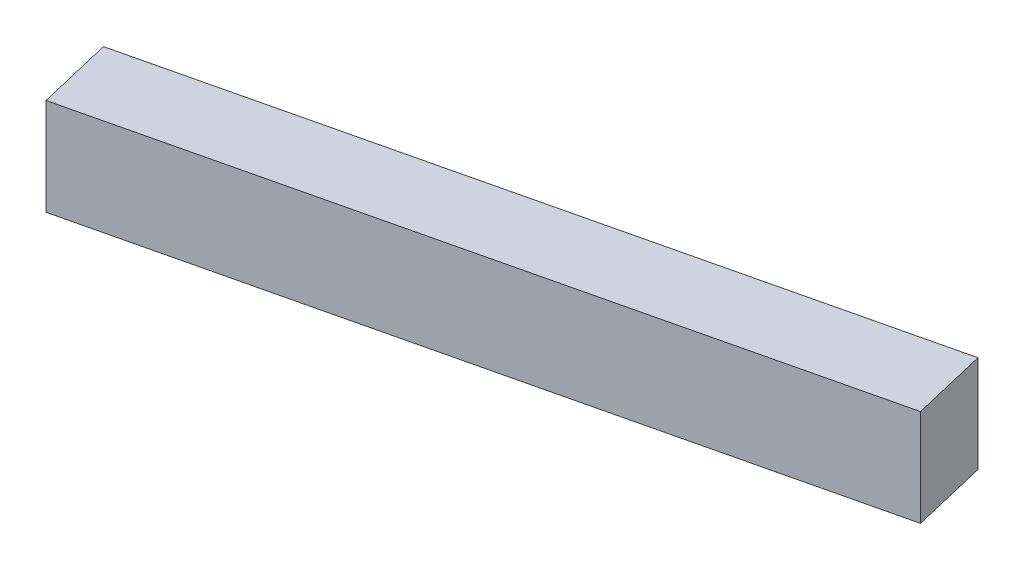
ISO-10303-21;
HEADER;
FILE_DESCRIPTION(('STEP AP214'),'2;1');
FILE_NAME('part.step','',(''),(''),'','','');
FILE_SCHEMA(('AUTOMOTIVE_DESIGN { 1 0 10303 214 1 1 1 1 }'));
ENDSEC;
DATA;
#1=APPLICATION_CONTEXT('core data for automotive mechanical design processes');
#2=APPLICATION_PROTOCOL_DEFINITION('international standard','automotive_design',2000,#1);
#3=PRODUCT_CONTEXT('',#1,'mechanical');
#4=PRODUCT('Part','Part','',(#3));
#5=PRODUCT_RELATED_PRODUCT_CATEGORY('part','',(#4));
#6=PRODUCT_DEFINITION_FORMATION('','',#4);
#7=PRODUCT_DEFINITION_CONTEXT('part definition',#1,'design');
#8=PRODUCT_DEFINITION('design','',#6,#7);
#9=PRODUCT_DEFINITION_SHAPE('','',#8);
#10=(LENGTH_UNIT() NAMED_UNIT(*) SI_UNIT(.MILLI.,.METRE.));
#11=(NAMED_UNIT(*) PLANE_ANGLE_UNIT() SI_UNIT($,.RADIAN.));
#12=(NAMED_UNIT(*) SI_UNIT($,.STERADIAN.) SOLID_ANGLE_UNIT());
#13=UNCERTAINTY_MEASURE_WITH_UNIT(LENGTH_MEASURE(1.E-05),#10,'distance_accuracy_value','');
#14=(GEOMETRIC_REPRESENTATION_CONTEXT(3) GLOBAL_UNCERTAINTY_ASSIGNED_CONTEXT((#13)) GLOBAL_UNIT_ASSIGNED_CONTEXT((#10,
#11,#12)) REPRESENTATION_CONTEXT('',''));
#15=CARTESIAN_POINT('',(0.,0.,0.));
#16=DIRECTION('',(0.,0.,1.));
#17=DIRECTION('',(1.,0.,0.));
#18=AXIS2_PLACEMENT_3D('',#15,#16,#17);
#19=CARTESIAN_POINT('',(-17.4862094224648,7.874,4.25627460206232));
#20=DIRECTION('',(-0.231034759331664,0.,-0.972945496921878));
#21=DIRECTION('',(-0.972945496921878,0.,0.231034759331664));
#22=AXIS2_PLACEMENT_3D('',#19,#20,#21);
#23=PLANE('',#22);
#24=DIRECTION('',(0.,1.,0.));
#25=VECTOR('',#24,1.);
#26=CARTESIAN_POINT('',(-17.4862094224648,7.874,4.25627460206232));
#27=LINE('',#26,#25);
#28=CARTESIAN_POINT('',(-17.4862094224648,7.62,4.25627460206232));
#29=VERTEX_POINT('',#28);
#30=CARTESIAN_POINT('',(-17.4862094224648,7.874,4.25627460206232));
#31=VERTEX_POINT('',#30);
#32=EDGE_CURVE('E20',#29,#31,#27,.T.);
#33=ORIENTED_EDGE('',*,*,#32,.T.);
#34=DIRECTION('',(-0.972945496921879,0.,0.231034759331661));
#35=VECTOR('',#34,1.);
#36=CARTESIAN_POINT('',(-17.4862094224648,7.874,4.25627460206232));
#37=LINE('',#36,#35);
#38=CARTESIAN_POINT('',(-19.339670594101,7.874,4.69639581858914));
#39=VERTEX_POINT('',#38);
#40=EDGE_CURVE('E55',#31,#39,#37,.T.);
#41=ORIENTED_EDGE('',*,*,#40,.T.);
#42=DIRECTION('',(0.,1.,0.));
#43=VECTOR('',#42,1.);
#44=CARTESIAN_POINT('',(-19.339670594101,7.874,4.69639581858914));
#45=LINE('',#44,#43);
#46=CARTESIAN_POINT('',(-19.339670594101,7.62,4.69639581858914));
#47=VERTEX_POINT('',#46);
#48=EDGE_CURVE('E76',#39,#47,#45,.F.);
#49=ORIENTED_EDGE('',*,*,#48,.T.);
#50=DIRECTION('',(-0.972945496921879,0.,0.231034759331661));
#51=VECTOR('',#50,1.);
#52=CARTESIAN_POINT('',(-17.4862094224648,7.62,4.25627460206232));
#53=LINE('',#52,#51);
#54=EDGE_CURVE('E58',#29,#47,#53,.T.);
#55=ORIENTED_EDGE('',*,*,#54,.F.);
#56=EDGE_LOOP('',(#33,#41,#49,#55));
#57=FACE_BOUND('',#56,.T.);
#58=ADVANCED_FACE('F17',(#57),#23,.F.);
#59=CARTESIAN_POINT('',(-17.4862094224648,7.874,4.25627460206232));
#60=DIRECTION('',(-0.97294549692188,0.,0.231034759331657));
#61=DIRECTION('',(0.231034759331657,0.,0.97294549692188));
#62=AXIS2_PLACEMENT_3D('',#59,#60,#61);
#63=PLANE('',#62);
#64=DIRECTION('',(0.,1.,0.));
#65=VECTOR('',#64,1.);
#66=CARTESIAN_POINT('',(-17.533155685561,7.874,4.05857207708779));
#67=LINE('',#66,#65);
#68=CARTESIAN_POINT('',(-17.533155685561,7.62,4.05857207708779));
#69=VERTEX_POINT('',#68);
#70=CARTESIAN_POINT('',(-17.533155685561,7.874,4.05857207708779));
#71=VERTEX_POINT('',#70);
#72=EDGE_CURVE('E73',#69,#71,#67,.T.);
#73=ORIENTED_EDGE('',*,*,#72,.T.);
#74=DIRECTION('',(0.231034759331687,0.,0.972945496921872));
#75=VECTOR('',#74,1.);
#76=CARTESIAN_POINT('',(-17.533155685561,7.874,4.05857207708779));
#77=LINE('',#76,#75);
#78=EDGE_CURVE('E63',#71,#31,#77,.T.);
#79=ORIENTED_EDGE('',*,*,#78,.T.);
#80=ORIENTED_EDGE('',*,*,#32,.F.);
#81=DIRECTION('',(0.231034759331687,0.,0.972945496921872));
#82=VECTOR('',#81,1.);
#83=CARTESIAN_POINT('',(-17.533155685561,7.62,4.05857207708779));
#84=LINE('',#83,#82);
#85=EDGE_CURVE('E80',#69,#29,#84,.T.);
#86=ORIENTED_EDGE('',*,*,#85,.F.);
#87=EDGE_LOOP('',(#73,#79,#80,#86));
#88=FACE_BOUND('',#87,.T.);
#89=ADVANCED_FACE('F72',(#88),#63,.F.);
#90=CARTESIAN_POINT('',(-17.4862094224648,7.874,4.25627460206232));
#91=DIRECTION('',(0.,-1.,0.));
#92=DIRECTION('',(0.,0.,-1.));
#93=AXIS2_PLACEMENT_3D('',#90,#91,#92);
#94=PLANE('',#93);
#95=ORIENTED_EDGE('',*,*,#78,.F.);
#96=DIRECTION('',(0.972945496921878,0.,-0.231034759331665));
#97=VECTOR('',#96,1.);
#98=CARTESIAN_POINT('',(-17.533155685561,7.874,4.05857207708779));
#99=LINE('',#98,#97);
#100=CARTESIAN_POINT('',(-19.3866168574982,7.874,4.49869329368608));
#101=VERTEX_POINT('',#100);
#102=EDGE_CURVE('E83',#71,#101,#99,.F.);
#103=ORIENTED_EDGE('',*,*,#102,.T.);
#104=DIRECTION('',(-0.231034760812817,0.,-0.972945496570165));
#105=VECTOR('',#104,1.);
#106=CARTESIAN_POINT('',(-19.339670594101,7.874,4.69639581858914));
#107=LINE('',#106,#105);
#108=EDGE_CURVE('E69',#101,#39,#107,.F.);
#109=ORIENTED_EDGE('',*,*,#108,.T.);
#110=ORIENTED_EDGE('',*,*,#40,.F.);
#111=EDGE_LOOP('',(#95,#103,#109,#110));
#112=FACE_BOUND('',#111,.T.);
#113=ADVANCED_FACE('F66',(#112),#94,.F.);
#114=CARTESIAN_POINT('',(-19.339670594101,7.874,4.69639581858914));
#115=DIRECTION('',(0.972945496570165,0.,-0.231034760812817));
#116=DIRECTION('',(-0.231034760812817,0.,-0.972945496570165));
#117=AXIS2_PLACEMENT_3D('',#114,#115,#116);
#118=PLANE('',#117);
#119=ORIENTED_EDGE('',*,*,#48,.F.);
#120=ORIENTED_EDGE('',*,*,#108,.F.);
#121=DIRECTION('',(0.,1.,0.));
#122=VECTOR('',#121,1.);
#123=CARTESIAN_POINT('',(-19.3866168574982,7.874,4.49869329368609));
#124=LINE('',#123,#122);
#125=CARTESIAN_POINT('',(-19.3866168574982,7.62,4.49869329368608));
#126=VERTEX_POINT('',#125);
#127=EDGE_CURVE('E26',#101,#126,#124,.F.);
#128=ORIENTED_EDGE('',*,*,#127,.T.);
#129=DIRECTION('',(-0.231034760812975,0.,-0.972945496570127));
#130=VECTOR('',#129,1.);
#131=CARTESIAN_POINT('',(-19.339670594101,7.62,4.69639581858914));
#132=LINE('',#131,#130);
#133=EDGE_CURVE('E34',#47,#126,#132,.T.);
#134=ORIENTED_EDGE('',*,*,#133,.F.);
#135=EDGE_LOOP('',(#119,#120,#128,#134));
#136=FACE_BOUND('',#135,.T.);
#137=ADVANCED_FACE('F88',(#136),#118,.F.);
#138=CARTESIAN_POINT('',(-17.4862094224648,7.62,4.25627460206232));
#139=DIRECTION('',(0.,-1.,0.));
#140=DIRECTION('',(0.,0.,-1.));
#141=AXIS2_PLACEMENT_3D('',#138,#139,#140);
#142=PLANE('',#141);
#143=DIRECTION('',(0.972945496921878,0.,-0.231034759331665));
#144=VECTOR('',#143,1.);
#145=CARTESIAN_POINT('',(-17.533155685561,7.62,4.05857207708779));
#146=LINE('',#145,#144);
#147=EDGE_CURVE('E11',#126,#69,#146,.T.);
#148=ORIENTED_EDGE('',*,*,#147,.T.);
#149=ORIENTED_EDGE('',*,*,#85,.T.);
#150=ORIENTED_EDGE('',*,*,#54,.T.);
#151=ORIENTED_EDGE('',*,*,#133,.T.);
#152=EDGE_LOOP('',(#148,#149,#150,#151));
#153=FACE_BOUND('',#152,.T.);
#154=ADVANCED_FACE('F91',(#153),#142,.T.);
#155=CARTESIAN_POINT('',(-17.533155685561,7.874,4.05857207708779));
#156=DIRECTION('',(0.231034759331665,0.,0.972945496921878));
#157=DIRECTION('',(0.972945496921878,0.,-0.231034759331665));
#158=AXIS2_PLACEMENT_3D('',#155,#156,#157);
#159=PLANE('',#158);
#160=ORIENTED_EDGE('',*,*,#127,.F.);
#161=ORIENTED_EDGE('',*,*,#102,.F.);
#162=ORIENTED_EDGE('',*,*,#72,.F.);
#163=ORIENTED_EDGE('',*,*,#147,.F.);
#164=EDGE_LOOP('',(#160,#161,#162,#163));
#165=FACE_BOUND('',#164,.T.);
#166=ADVANCED_FACE('F90',(#165),#159,.F.);
#167=CLOSED_SHELL('',(#58,#89,#113,#137,#154,#166));
#168=MANIFOLD_SOLID_BREP('B1',#167);
#169=ADVANCED_BREP_SHAPE_REPRESENTATION('',(#18,#168),#14);
#170=SHAPE_DEFINITION_REPRESENTATION(#9,#169);
ENDSEC;
END-ISO-10303-21;
